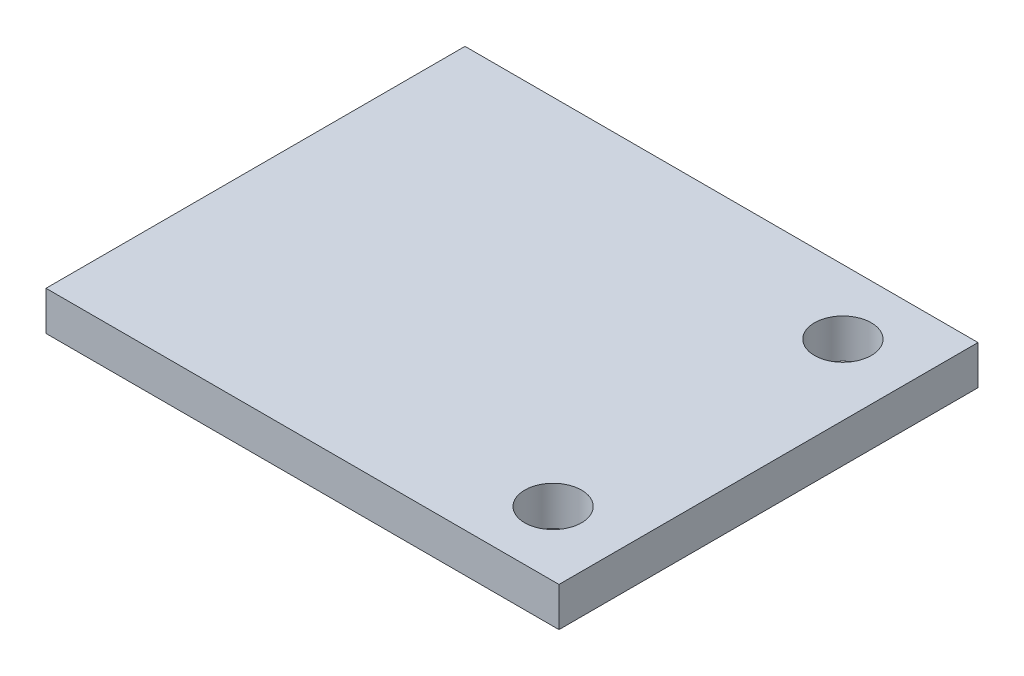
ISO-10303-21;
HEADER;
FILE_DESCRIPTION(('STEP AP214'),'2;1');
FILE_NAME('part.step','',(''),(''),'','','');
FILE_SCHEMA(('AUTOMOTIVE_DESIGN { 1 0 10303 214 1 1 1 1 }'));
ENDSEC;
DATA;
#1=APPLICATION_CONTEXT('core data for automotive mechanical design processes');
#2=APPLICATION_PROTOCOL_DEFINITION('international standard','automotive_design',2000,#1);
#3=PRODUCT_CONTEXT('',#1,'mechanical');
#4=PRODUCT('Part','Part','',(#3));
#5=PRODUCT_RELATED_PRODUCT_CATEGORY('part','',(#4));
#6=PRODUCT_DEFINITION_FORMATION('','',#4);
#7=PRODUCT_DEFINITION_CONTEXT('part definition',#1,'design');
#8=PRODUCT_DEFINITION('design','',#6,#7);
#9=PRODUCT_DEFINITION_SHAPE('','',#8);
#10=(LENGTH_UNIT() NAMED_UNIT(*) SI_UNIT(.MILLI.,.METRE.));
#11=(NAMED_UNIT(*) PLANE_ANGLE_UNIT() SI_UNIT($,.RADIAN.));
#12=(NAMED_UNIT(*) SI_UNIT($,.STERADIAN.) SOLID_ANGLE_UNIT());
#13=UNCERTAINTY_MEASURE_WITH_UNIT(LENGTH_MEASURE(1.E-05),#10,'distance_accuracy_value','');
#14=(GEOMETRIC_REPRESENTATION_CONTEXT(3) GLOBAL_UNCERTAINTY_ASSIGNED_CONTEXT((#13)) GLOBAL_UNIT_ASSIGNED_CONTEXT((#10,
#11,#12)) REPRESENTATION_CONTEXT('',''));
#15=CARTESIAN_POINT('',(0.,0.,0.));
#16=DIRECTION('',(0.,0.,1.));
#17=DIRECTION('',(1.,0.,0.));
#18=AXIS2_PLACEMENT_3D('',#15,#16,#17);
#19=CARTESIAN_POINT('',(26.2,2.,21.4));
#20=DIRECTION('',(0.,-1.,0.));
#21=DIRECTION('',(1.,0.,0.));
#22=AXIS2_PLACEMENT_3D('',#19,#20,#21);
#23=PLANE('',#22);
#24=DIRECTION('',(0.,0.,-1.));
#25=VECTOR('',#24,1.);
#26=CARTESIAN_POINT('',(0.,2.,21.4));
#27=LINE('',#26,#25);
#28=CARTESIAN_POINT('',(0.,2.,0.));
#29=VERTEX_POINT('',#28);
#30=CARTESIAN_POINT('',(0.,2.,21.4));
#31=VERTEX_POINT('',#30);
#32=EDGE_CURVE('E57',#29,#31,#27,.F.);
#33=ORIENTED_EDGE('',*,*,#32,.T.);
#34=DIRECTION('',(1.,0.,0.));
#35=VECTOR('',#34,1.);
#36=CARTESIAN_POINT('',(0.,2.,21.4));
#37=LINE('',#36,#35);
#38=CARTESIAN_POINT('',(26.2,2.,21.4));
#39=VERTEX_POINT('',#38);
#40=EDGE_CURVE('E54',#39,#31,#37,.F.);
#41=ORIENTED_EDGE('',*,*,#40,.F.);
#42=DIRECTION('',(0.,0.,1.));
#43=VECTOR('',#42,1.);
#44=CARTESIAN_POINT('',(26.2,2.,21.4));
#45=LINE('',#44,#43);
#46=CARTESIAN_POINT('',(26.2,2.,0.));
#47=VERTEX_POINT('',#46);
#48=EDGE_CURVE('E177',#39,#47,#45,.F.);
#49=ORIENTED_EDGE('',*,*,#48,.T.);
#50=DIRECTION('',(1.,0.,0.));
#51=VECTOR('',#50,1.);
#52=CARTESIAN_POINT('',(0.,2.,0.));
#53=LINE('',#52,#51);
#54=EDGE_CURVE('E59',#47,#29,#53,.F.);
#55=ORIENTED_EDGE('',*,*,#54,.T.);
#56=EDGE_LOOP('',(#33,#41,#49,#55));
#57=FACE_BOUND('',#56,.T.);
#58=CARTESIAN_POINT('',(22.6,2.,18.1));
#59=DIRECTION('',(0.,1.,0.));
#60=DIRECTION('',(-1.,0.,0.));
#61=AXIS2_PLACEMENT_3D('',#58,#59,#60);
#62=CIRCLE('',#61,1.45);
#63=CARTESIAN_POINT('',(21.15,2.,18.1));
#64=VERTEX_POINT('',#63);
#65=EDGE_CURVE('E65',#64,#64,#62,.F.);
#66=ORIENTED_EDGE('',*,*,#65,.T.);
#67=EDGE_LOOP('',(#66));
#68=FACE_BOUND('',#67,.T.);
#69=CARTESIAN_POINT('',(22.6,2.,3.3));
#70=DIRECTION('',(0.,1.,0.));
#71=DIRECTION('',(-1.,0.,0.));
#72=AXIS2_PLACEMENT_3D('',#69,#70,#71);
#73=CIRCLE('',#72,1.45);
#74=CARTESIAN_POINT('',(21.15,2.,3.3));
#75=VERTEX_POINT('',#74);
#76=EDGE_CURVE('E19',#75,#75,#73,.F.);
#77=ORIENTED_EDGE('',*,*,#76,.T.);
#78=EDGE_LOOP('',(#77));
#79=FACE_BOUND('',#78,.T.);
#80=ADVANCED_FACE('F16',(#57,#68,#79),#23,.F.);
#81=CARTESIAN_POINT('',(22.6,0.,3.3));
#82=DIRECTION('',(0.,1.,0.));
#83=DIRECTION('',(-1.,0.,0.));
#84=AXIS2_PLACEMENT_3D('',#81,#82,#83);
#85=CYLINDRICAL_SURFACE('',#84,1.45);
#86=ORIENTED_EDGE('',*,*,#76,.F.);
#87=EDGE_LOOP('',(#86));
#88=FACE_BOUND('',#87,.T.);
#89=CARTESIAN_POINT('',(22.6,0.,3.3));
#90=DIRECTION('',(0.,1.,0.));
#91=DIRECTION('',(-1.,0.,0.));
#92=AXIS2_PLACEMENT_3D('',#89,#90,#91);
#93=CIRCLE('',#92,1.45);
#94=CARTESIAN_POINT('',(21.15,0.,3.3));
#95=VERTEX_POINT('',#94);
#96=EDGE_CURVE('E83',#95,#95,#93,.F.);
#97=ORIENTED_EDGE('',*,*,#96,.T.);
#98=EDGE_LOOP('',(#97));
#99=FACE_BOUND('',#98,.T.);
#100=ADVANCED_FACE('F92',(#88,#99),#85,.F.);
#101=CARTESIAN_POINT('',(22.6,0.,18.1));
#102=DIRECTION('',(0.,1.,0.));
#103=DIRECTION('',(-1.,0.,0.));
#104=AXIS2_PLACEMENT_3D('',#101,#102,#103);
#105=CYLINDRICAL_SURFACE('',#104,1.45);
#106=ORIENTED_EDGE('',*,*,#65,.F.);
#107=EDGE_LOOP('',(#106));
#108=FACE_BOUND('',#107,.T.);
#109=CARTESIAN_POINT('',(22.6,0.,18.1));
#110=DIRECTION('',(0.,1.,0.));
#111=DIRECTION('',(-1.,0.,0.));
#112=AXIS2_PLACEMENT_3D('',#109,#110,#111);
#113=CIRCLE('',#112,1.45);
#114=CARTESIAN_POINT('',(21.15,0.,18.1));
#115=VERTEX_POINT('',#114);
#116=EDGE_CURVE('E80',#115,#115,#113,.F.);
#117=ORIENTED_EDGE('',*,*,#116,.T.);
#118=EDGE_LOOP('',(#117));
#119=FACE_BOUND('',#118,.T.);
#120=ADVANCED_FACE('F95',(#108,#119),#105,.F.);
#121=CARTESIAN_POINT('',(0.,2.,21.4));
#122=DIRECTION('',(1.,0.,0.));
#123=DIRECTION('',(0.,0.,-1.));
#124=AXIS2_PLACEMENT_3D('',#121,#122,#123);
#125=PLANE('',#124);
#126=DIRECTION('',(0.,0.,1.));
#127=VECTOR('',#126,1.);
#128=CARTESIAN_POINT('',(0.,0.,21.4));
#129=LINE('',#128,#127);
#130=CARTESIAN_POINT('',(0.,0.,0.));
#131=VERTEX_POINT('',#130);
#132=CARTESIAN_POINT('',(0.,0.,21.4));
#133=VERTEX_POINT('',#132);
#134=EDGE_CURVE('E76',#131,#133,#129,.T.);
#135=ORIENTED_EDGE('',*,*,#134,.T.);
#136=DIRECTION('',(0.,1.,0.));
#137=VECTOR('',#136,1.);
#138=CARTESIAN_POINT('',(0.,0.,21.4));
#139=LINE('',#138,#137);
#140=EDGE_CURVE('E64',#31,#133,#139,.F.);
#141=ORIENTED_EDGE('',*,*,#140,.F.);
#142=ORIENTED_EDGE('',*,*,#32,.F.);
#143=DIRECTION('',(0.,1.,0.));
#144=VECTOR('',#143,1.);
#145=CARTESIAN_POINT('',(0.,0.,0.));
#146=LINE('',#145,#144);
#147=EDGE_CURVE('E85',#29,#131,#146,.F.);
#148=ORIENTED_EDGE('',*,*,#147,.T.);
#149=EDGE_LOOP('',(#135,#141,#142,#148));
#150=FACE_BOUND('',#149,.T.);
#151=ADVANCED_FACE('F75',(#150),#125,.F.);
#152=CARTESIAN_POINT('',(0.,0.,21.4));
#153=DIRECTION('',(0.,0.,1.));
#154=DIRECTION('',(1.,0.,0.));
#155=AXIS2_PLACEMENT_3D('',#152,#153,#154);
#156=PLANE('',#155);
#157=DIRECTION('',(0.,1.,0.));
#158=VECTOR('',#157,1.);
#159=CARTESIAN_POINT('',(26.2,0.,21.4));
#160=LINE('',#159,#158);
#161=CARTESIAN_POINT('',(26.2,0.,21.4));
#162=VERTEX_POINT('',#161);
#163=EDGE_CURVE('E72',#162,#39,#160,.T.);
#164=ORIENTED_EDGE('',*,*,#163,.T.);
#165=ORIENTED_EDGE('',*,*,#40,.T.);
#166=ORIENTED_EDGE('',*,*,#140,.T.);
#167=DIRECTION('',(-1.,0.,0.));
#168=VECTOR('',#167,1.);
#169=CARTESIAN_POINT('',(0.,0.,21.4));
#170=LINE('',#169,#168);
#171=EDGE_CURVE('E185',#133,#162,#170,.F.);
#172=ORIENTED_EDGE('',*,*,#171,.T.);
#173=EDGE_LOOP('',(#164,#165,#166,#172));
#174=FACE_BOUND('',#173,.T.);
#175=ADVANCED_FACE('F69',(#174),#156,.T.);
#176=CARTESIAN_POINT('',(26.2,0.,21.4));
#177=DIRECTION('',(-1.,0.,0.));
#178=DIRECTION('',(0.,0.,1.));
#179=AXIS2_PLACEMENT_3D('',#176,#177,#178);
#180=PLANE('',#179);
#181=ORIENTED_EDGE('',*,*,#48,.F.);
#182=ORIENTED_EDGE('',*,*,#163,.F.);
#183=DIRECTION('',(0.,0.,1.));
#184=VECTOR('',#183,1.);
#185=CARTESIAN_POINT('',(26.2,0.,21.4));
#186=LINE('',#185,#184);
#187=CARTESIAN_POINT('',(26.2,0.,0.));
#188=VERTEX_POINT('',#187);
#189=EDGE_CURVE('E25',#162,#188,#186,.F.);
#190=ORIENTED_EDGE('',*,*,#189,.T.);
#191=DIRECTION('',(0.,1.,0.));
#192=VECTOR('',#191,1.);
#193=CARTESIAN_POINT('',(26.2,0.,0.));
#194=LINE('',#193,#192);
#195=EDGE_CURVE('E33',#188,#47,#194,.T.);
#196=ORIENTED_EDGE('',*,*,#195,.T.);
#197=EDGE_LOOP('',(#181,#182,#190,#196));
#198=FACE_BOUND('',#197,.T.);
#199=ADVANCED_FACE('F107',(#198),#180,.F.);
#200=CARTESIAN_POINT('',(0.,0.,0.));
#201=DIRECTION('',(0.,0.,1.));
#202=DIRECTION('',(1.,0.,0.));
#203=AXIS2_PLACEMENT_3D('',#200,#201,#202);
#204=PLANE('',#203);
#205=ORIENTED_EDGE('',*,*,#54,.F.);
#206=ORIENTED_EDGE('',*,*,#195,.F.);
#207=DIRECTION('',(-1.,0.,0.));
#208=VECTOR('',#207,1.);
#209=CARTESIAN_POINT('',(0.,0.,0.));
#210=LINE('',#209,#208);
#211=EDGE_CURVE('E11',#188,#131,#210,.T.);
#212=ORIENTED_EDGE('',*,*,#211,.T.);
#213=ORIENTED_EDGE('',*,*,#147,.F.);
#214=EDGE_LOOP('',(#205,#206,#212,#213));
#215=FACE_BOUND('',#214,.T.);
#216=ADVANCED_FACE('F100',(#215),#204,.F.);
#217=CARTESIAN_POINT('',(0.,0.,21.4));
#218=DIRECTION('',(0.,1.,0.));
#219=DIRECTION('',(-1.,0.,0.));
#220=AXIS2_PLACEMENT_3D('',#217,#218,#219);
#221=PLANE('',#220);
#222=ORIENTED_EDGE('',*,*,#189,.F.);
#223=ORIENTED_EDGE('',*,*,#171,.F.);
#224=ORIENTED_EDGE('',*,*,#134,.F.);
#225=ORIENTED_EDGE('',*,*,#211,.F.);
#226=EDGE_LOOP('',(#222,#223,#224,#225));
#227=FACE_BOUND('',#226,.T.);
#228=ORIENTED_EDGE('',*,*,#116,.F.);
#229=EDGE_LOOP('',(#228));
#230=FACE_BOUND('',#229,.T.);
#231=ORIENTED_EDGE('',*,*,#96,.F.);
#232=EDGE_LOOP('',(#231));
#233=FACE_BOUND('',#232,.T.);
#234=ADVANCED_FACE('F98',(#227,#230,#233),#221,.F.);
#235=CLOSED_SHELL('',(#80,#100,#120,#151,#175,#199,#216,#234));
#236=MANIFOLD_SOLID_BREP('B1',#235);
#237=ADVANCED_BREP_SHAPE_REPRESENTATION('',(#18,#236),#14);
#238=SHAPE_DEFINITION_REPRESENTATION(#9,#237);
ENDSEC;
END-ISO-10303-21;
